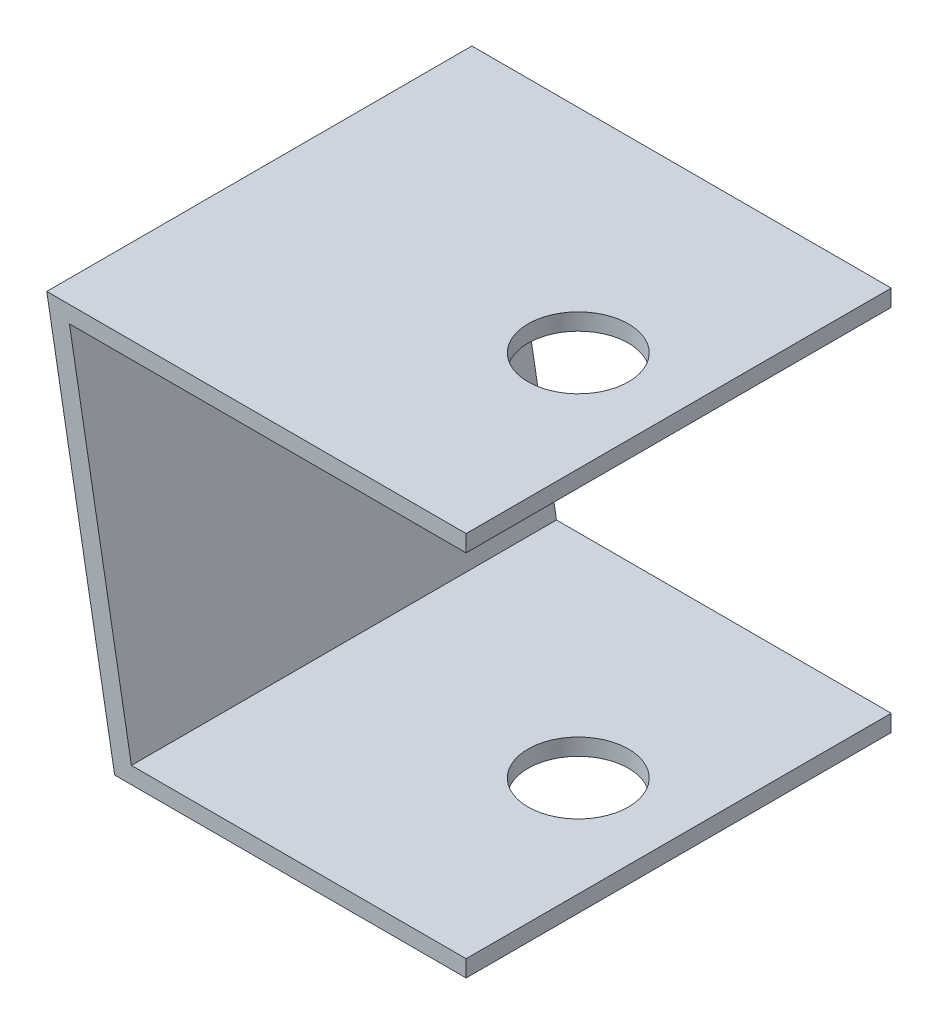
ISO-10303-21;
HEADER;
FILE_DESCRIPTION(('STEP AP214'),'2;1');
FILE_NAME('part.step','',(''),(''),'','','');
FILE_SCHEMA(('AUTOMOTIVE_DESIGN { 1 0 10303 214 1 1 1 1 }'));
ENDSEC;
DATA;
#1=APPLICATION_CONTEXT('core data for automotive mechanical design processes');
#2=APPLICATION_PROTOCOL_DEFINITION('international standard','automotive_design',2000,#1);
#3=PRODUCT_CONTEXT('',#1,'mechanical');
#4=PRODUCT('Part','Part','',(#3));
#5=PRODUCT_RELATED_PRODUCT_CATEGORY('part','',(#4));
#6=PRODUCT_DEFINITION_FORMATION('','',#4);
#7=PRODUCT_DEFINITION_CONTEXT('part definition',#1,'design');
#8=PRODUCT_DEFINITION('design','',#6,#7);
#9=PRODUCT_DEFINITION_SHAPE('','',#8);
#10=(LENGTH_UNIT() NAMED_UNIT(*) SI_UNIT(.MILLI.,.METRE.));
#11=(NAMED_UNIT(*) PLANE_ANGLE_UNIT() SI_UNIT($,.RADIAN.));
#12=(NAMED_UNIT(*) SI_UNIT($,.STERADIAN.) SOLID_ANGLE_UNIT());
#13=UNCERTAINTY_MEASURE_WITH_UNIT(LENGTH_MEASURE(1.E-05),#10,'distance_accuracy_value','');
#14=(GEOMETRIC_REPRESENTATION_CONTEXT(3) GLOBAL_UNCERTAINTY_ASSIGNED_CONTEXT((#13)) GLOBAL_UNIT_ASSIGNED_CONTEXT((#10,
#11,#12)) REPRESENTATION_CONTEXT('',''));
#15=CARTESIAN_POINT('',(0.,0.,0.));
#16=DIRECTION('',(0.,0.,1.));
#17=DIRECTION('',(1.,0.,0.));
#18=AXIS2_PLACEMENT_3D('',#15,#16,#17);
#19=CARTESIAN_POINT('',(15.,155.42638667498,31.75));
#20=DIRECTION('',(-1.,0.,0.));
#21=DIRECTION('',(0.,0.,1.));
#22=AXIS2_PLACEMENT_3D('',#19,#20,#21);
#23=PLANE('',#22);
#24=DIRECTION('',(0.,1.,0.));
#25=VECTOR('',#24,1.);
#26=CARTESIAN_POINT('',(15.,155.42638667498,-31.75));
#27=LINE('',#26,#25);
#28=CARTESIAN_POINT('',(15.,152.92638667498,-31.75));
#29=VERTEX_POINT('',#28);
#30=CARTESIAN_POINT('',(15.,155.42638667498,-31.75));
#31=VERTEX_POINT('',#30);
#32=EDGE_CURVE('E126',#29,#31,#27,.T.);
#33=ORIENTED_EDGE('',*,*,#32,.T.);
#34=DIRECTION('',(0.,0.,-1.));
#35=VECTOR('',#34,1.);
#36=CARTESIAN_POINT('',(15.,155.42638667498,31.75));
#37=LINE('',#36,#35);
#38=CARTESIAN_POINT('',(15.,155.42638667498,31.75));
#39=VERTEX_POINT('',#38);
#40=EDGE_CURVE('E11',#39,#31,#37,.T.);
#41=ORIENTED_EDGE('',*,*,#40,.F.);
#42=DIRECTION('',(0.,1.,0.));
#43=VECTOR('',#42,1.);
#44=CARTESIAN_POINT('',(15.,155.42638667498,31.75));
#45=LINE('',#44,#43);
#46=CARTESIAN_POINT('',(15.,152.92638667498,31.75));
#47=VERTEX_POINT('',#46);
#48=EDGE_CURVE('E140',#47,#39,#45,.T.);
#49=ORIENTED_EDGE('',*,*,#48,.F.);
#50=DIRECTION('',(0.,0.,-1.));
#51=VECTOR('',#50,1.);
#52=CARTESIAN_POINT('',(15.,152.92638667498,31.75));
#53=LINE('',#52,#51);
#54=EDGE_CURVE('E125',#47,#29,#53,.T.);
#55=ORIENTED_EDGE('',*,*,#54,.T.);
#56=EDGE_LOOP('',(#33,#41,#49,#55));
#57=FACE_BOUND('',#56,.T.);
#58=ADVANCED_FACE('F33',(#57),#23,.F.);
#59=CARTESIAN_POINT('',(-37.4999999999988,155.42638667498,31.75));
#60=DIRECTION('',(0.,-1.,0.));
#61=DIRECTION('',(0.,0.,-1.));
#62=AXIS2_PLACEMENT_3D('',#59,#60,#61);
#63=PLANE('',#62);
#64=CARTESIAN_POINT('',(0.,155.42638667498,0.));
#65=DIRECTION('',(0.,1.,0.));
#66=DIRECTION('',(0.,0.,1.));
#67=AXIS2_PLACEMENT_3D('',#64,#65,#66);
#68=CIRCLE('',#67,7.5);
#69=CARTESIAN_POINT('',(0.,155.42638667498,7.5));
#70=VERTEX_POINT('',#69);
#71=EDGE_CURVE('E182',#70,#70,#68,.T.);
#72=ORIENTED_EDGE('',*,*,#71,.F.);
#73=EDGE_LOOP('',(#72));
#74=FACE_BOUND('',#73,.T.);
#75=DIRECTION('',(-1.,0.,0.));
#76=VECTOR('',#75,1.);
#77=CARTESIAN_POINT('',(-37.4999999999988,155.42638667498,-31.75));
#78=LINE('',#77,#76);
#79=CARTESIAN_POINT('',(-47.6388013907359,155.42638667498,-31.75));
#80=VERTEX_POINT('',#79);
#81=EDGE_CURVE('E129',#31,#80,#78,.T.);
#82=ORIENTED_EDGE('',*,*,#81,.T.);
#83=DIRECTION('',(0.,0.,1.));
#84=VECTOR('',#83,1.);
#85=CARTESIAN_POINT('',(-47.6388013907359,155.42638667498,-31.75));
#86=LINE('',#85,#84);
#87=CARTESIAN_POINT('',(-47.6388013907359,155.42638667498,31.75));
#88=VERTEX_POINT('',#87);
#89=EDGE_CURVE('E130',#80,#88,#86,.T.);
#90=ORIENTED_EDGE('',*,*,#89,.T.);
#91=DIRECTION('',(-1.,0.,0.));
#92=VECTOR('',#91,1.);
#93=CARTESIAN_POINT('',(-37.4999999999988,155.42638667498,31.75));
#94=LINE('',#93,#92);
#95=EDGE_CURVE('E87',#39,#88,#94,.T.);
#96=ORIENTED_EDGE('',*,*,#95,.F.);
#97=ORIENTED_EDGE('',*,*,#40,.T.);
#98=EDGE_LOOP('',(#82,#90,#96,#97));
#99=FACE_BOUND('',#98,.T.);
#100=ADVANCED_FACE('F164',(#74,#99),#63,.F.);
#101=CARTESIAN_POINT('',(15.,97.9263866749797,31.75));
#102=DIRECTION('',(0.,1.,0.));
#103=DIRECTION('',(0.,0.,1.));
#104=AXIS2_PLACEMENT_3D('',#101,#102,#103);
#105=PLANE('',#104);
#106=CARTESIAN_POINT('',(0.,97.9263866749797,0.));
#107=DIRECTION('',(0.,1.,0.));
#108=DIRECTION('',(0.,0.,1.));
#109=AXIS2_PLACEMENT_3D('',#106,#107,#108);
#110=CIRCLE('',#109,7.5);
#111=CARTESIAN_POINT('',(0.,97.9263866749797,7.5));
#112=VERTEX_POINT('',#111);
#113=EDGE_CURVE('E185',#112,#112,#110,.T.);
#114=ORIENTED_EDGE('',*,*,#113,.T.);
#115=EDGE_LOOP('',(#114));
#116=FACE_BOUND('',#115,.T.);
#117=DIRECTION('',(1.,0.,0.));
#118=VECTOR('',#117,1.);
#119=CARTESIAN_POINT('',(15.,97.9263866749797,-31.75));
#120=LINE('',#119,#118);
#121=CARTESIAN_POINT('',(-37.4999999999988,97.9263866749797,-31.75));
#122=VERTEX_POINT('',#121);
#123=CARTESIAN_POINT('',(15.,97.9263866749797,-31.75));
#124=VERTEX_POINT('',#123);
#125=EDGE_CURVE('E111',#122,#124,#120,.T.);
#126=ORIENTED_EDGE('',*,*,#125,.T.);
#127=DIRECTION('',(0.,0.,-1.));
#128=VECTOR('',#127,1.);
#129=CARTESIAN_POINT('',(15.,97.9263866749797,31.75));
#130=LINE('',#129,#128);
#131=CARTESIAN_POINT('',(15.,97.9263866749797,31.75));
#132=VERTEX_POINT('',#131);
#133=EDGE_CURVE('E108',#132,#124,#130,.T.);
#134=ORIENTED_EDGE('',*,*,#133,.F.);
#135=DIRECTION('',(1.,0.,0.));
#136=VECTOR('',#135,1.);
#137=CARTESIAN_POINT('',(15.,97.9263866749797,31.75));
#138=LINE('',#137,#136);
#139=CARTESIAN_POINT('',(-37.4999999999988,97.9263866749797,31.75));
#140=VERTEX_POINT('',#139);
#141=EDGE_CURVE('E95',#140,#132,#138,.T.);
#142=ORIENTED_EDGE('',*,*,#141,.F.);
#143=DIRECTION('',(0.,0.,-1.));
#144=VECTOR('',#143,1.);
#145=CARTESIAN_POINT('',(-37.4999999999988,97.9263866749797,31.75));
#146=LINE('',#145,#144);
#147=EDGE_CURVE('E41',#140,#122,#146,.T.);
#148=ORIENTED_EDGE('',*,*,#147,.T.);
#149=EDGE_LOOP('',(#126,#134,#142,#148));
#150=FACE_BOUND('',#149,.T.);
#151=ADVANCED_FACE('F109',(#116,#150),#105,.F.);
#152=CARTESIAN_POINT('',(15.,100.42638667498,31.75));
#153=DIRECTION('',(-1.,0.,0.));
#154=DIRECTION('',(0.,0.,1.));
#155=AXIS2_PLACEMENT_3D('',#152,#153,#154);
#156=PLANE('',#155);
#157=DIRECTION('',(0.,1.,0.));
#158=VECTOR('',#157,1.);
#159=CARTESIAN_POINT('',(15.,100.42638667498,-31.75));
#160=LINE('',#159,#158);
#161=CARTESIAN_POINT('',(15.,100.42638667498,-31.75));
#162=VERTEX_POINT('',#161);
#163=EDGE_CURVE('E134',#124,#162,#160,.T.);
#164=ORIENTED_EDGE('',*,*,#163,.T.);
#165=DIRECTION('',(0.,0.,-1.));
#166=VECTOR('',#165,1.);
#167=CARTESIAN_POINT('',(15.,100.42638667498,31.75));
#168=LINE('',#167,#166);
#169=CARTESIAN_POINT('',(15.,100.42638667498,31.75));
#170=VERTEX_POINT('',#169);
#171=EDGE_CURVE('E114',#170,#162,#168,.T.);
#172=ORIENTED_EDGE('',*,*,#171,.F.);
#173=DIRECTION('',(0.,1.,0.));
#174=VECTOR('',#173,1.);
#175=CARTESIAN_POINT('',(15.,100.42638667498,31.75));
#176=LINE('',#175,#174);
#177=EDGE_CURVE('E100',#132,#170,#176,.T.);
#178=ORIENTED_EDGE('',*,*,#177,.F.);
#179=ORIENTED_EDGE('',*,*,#133,.T.);
#180=EDGE_LOOP('',(#164,#172,#178,#179));
#181=FACE_BOUND('',#180,.T.);
#182=ADVANCED_FACE('F116',(#181),#156,.F.);
#183=CARTESIAN_POINT('',(-34.9999999999988,100.42638667498,31.75));
#184=DIRECTION('',(0.,-1.,0.));
#185=DIRECTION('',(1.,0.,0.));
#186=AXIS2_PLACEMENT_3D('',#183,#184,#185);
#187=PLANE('',#186);
#188=CARTESIAN_POINT('',(0.,100.42638667498,0.));
#189=DIRECTION('',(0.,-1.,0.));
#190=DIRECTION('',(1.,0.,0.));
#191=AXIS2_PLACEMENT_3D('',#188,#189,#190);
#192=CIRCLE('',#191,7.5);
#193=CARTESIAN_POINT('',(7.5,100.42638667498,0.));
#194=VERTEX_POINT('',#193);
#195=EDGE_CURVE('E177',#194,#194,#192,.T.);
#196=ORIENTED_EDGE('',*,*,#195,.T.);
#197=EDGE_LOOP('',(#196));
#198=FACE_BOUND('',#197,.T.);
#199=DIRECTION('',(-1.,0.,0.));
#200=VECTOR('',#199,1.);
#201=CARTESIAN_POINT('',(-34.9999999999988,100.42638667498,-31.75));
#202=LINE('',#201,#200);
#203=CARTESIAN_POINT('',(-34.9999999999988,100.42638667498,-31.75));
#204=VERTEX_POINT('',#203);
#205=EDGE_CURVE('E136',#162,#204,#202,.T.);
#206=ORIENTED_EDGE('',*,*,#205,.T.);
#207=DIRECTION('',(0.,0.,-1.));
#208=VECTOR('',#207,1.);
#209=CARTESIAN_POINT('',(-34.9999999999988,100.42638667498,31.75));
#210=LINE('',#209,#208);
#211=CARTESIAN_POINT('',(-34.9999999999988,100.42638667498,31.75));
#212=VERTEX_POINT('',#211);
#213=EDGE_CURVE('E142',#212,#204,#210,.T.);
#214=ORIENTED_EDGE('',*,*,#213,.F.);
#215=DIRECTION('',(-1.,0.,0.));
#216=VECTOR('',#215,1.);
#217=CARTESIAN_POINT('',(-34.9999999999988,100.42638667498,31.75));
#218=LINE('',#217,#216);
#219=EDGE_CURVE('E119',#170,#212,#218,.T.);
#220=ORIENTED_EDGE('',*,*,#219,.F.);
#221=ORIENTED_EDGE('',*,*,#171,.T.);
#222=EDGE_LOOP('',(#206,#214,#220,#221));
#223=FACE_BOUND('',#222,.T.);
#224=ADVANCED_FACE('F218',(#198,#223),#187,.F.);
#225=CARTESIAN_POINT('',(15.,152.92638667498,31.75));
#226=DIRECTION('',(0.,1.,0.));
#227=DIRECTION('',(0.,0.,1.));
#228=AXIS2_PLACEMENT_3D('',#225,#226,#227);
#229=PLANE('',#228);
#230=CARTESIAN_POINT('',(0.,152.92638667498,0.));
#231=DIRECTION('',(0.,1.,0.));
#232=DIRECTION('',(0.,0.,1.));
#233=AXIS2_PLACEMENT_3D('',#230,#231,#232);
#234=CIRCLE('',#233,7.5);
#235=CARTESIAN_POINT('',(0.,152.92638667498,7.5));
#236=VERTEX_POINT('',#235);
#237=EDGE_CURVE('E36',#236,#236,#234,.T.);
#238=ORIENTED_EDGE('',*,*,#237,.T.);
#239=EDGE_LOOP('',(#238));
#240=FACE_BOUND('',#239,.T.);
#241=DIRECTION('',(1.,0.,0.));
#242=VECTOR('',#241,1.);
#243=CARTESIAN_POINT('',(15.,152.92638667498,-31.75));
#244=LINE('',#243,#242);
#245=CARTESIAN_POINT('',(-44.2571664871935,152.92638667498,-31.75));
#246=VERTEX_POINT('',#245);
#247=EDGE_CURVE('E48',#246,#29,#244,.T.);
#248=ORIENTED_EDGE('',*,*,#247,.T.);
#249=ORIENTED_EDGE('',*,*,#54,.F.);
#250=DIRECTION('',(1.,0.,0.));
#251=VECTOR('',#250,1.);
#252=CARTESIAN_POINT('',(15.,152.92638667498,31.75));
#253=LINE('',#252,#251);
#254=CARTESIAN_POINT('',(-44.2571664871935,152.92638667498,31.75));
#255=VERTEX_POINT('',#254);
#256=EDGE_CURVE('E57',#255,#47,#253,.T.);
#257=ORIENTED_EDGE('',*,*,#256,.F.);
#258=DIRECTION('',(0.,0.,1.));
#259=VECTOR('',#258,1.);
#260=CARTESIAN_POINT('',(-44.2571664871935,152.92638667498,-31.75));
#261=LINE('',#260,#259);
#262=EDGE_CURVE('E156',#246,#255,#261,.T.);
#263=ORIENTED_EDGE('',*,*,#262,.F.);
#264=EDGE_LOOP('',(#248,#249,#257,#263));
#265=FACE_BOUND('',#264,.T.);
#266=ADVANCED_FACE('F166',(#240,#265),#229,.F.);
#267=CARTESIAN_POINT('',(0.,0.,31.75));
#268=DIRECTION('',(0.,0.,-1.));
#269=DIRECTION('',(-1.,0.,0.));
#270=AXIS2_PLACEMENT_3D('',#267,#268,#269);
#271=PLANE('',#270);
#272=ORIENTED_EDGE('',*,*,#219,.T.);
#273=DIRECTION('',(0.173648177666935,-0.984807753012207,0.));
#274=VECTOR('',#273,1.);
#275=CARTESIAN_POINT('',(-44.2571664871935,152.92638667498,31.75));
#276=LINE('',#275,#274);
#277=EDGE_CURVE('E174',#255,#212,#276,.T.);
#278=ORIENTED_EDGE('',*,*,#277,.F.);
#279=ORIENTED_EDGE('',*,*,#256,.T.);
#280=ORIENTED_EDGE('',*,*,#48,.T.);
#281=ORIENTED_EDGE('',*,*,#95,.T.);
#282=DIRECTION('',(0.173648177666935,-0.984807753012207,0.));
#283=VECTOR('',#282,1.);
#284=CARTESIAN_POINT('',(-37.4999999999988,97.9263866749797,31.75));
#285=LINE('',#284,#283);
#286=EDGE_CURVE('E103',#88,#140,#285,.T.);
#287=ORIENTED_EDGE('',*,*,#286,.T.);
#288=ORIENTED_EDGE('',*,*,#141,.T.);
#289=ORIENTED_EDGE('',*,*,#177,.T.);
#290=EDGE_LOOP('',(#272,#278,#279,#280,#281,#287,#288,#289));
#291=FACE_BOUND('',#290,.T.);
#292=ADVANCED_FACE('F98',(#291),#271,.F.);
#293=CARTESIAN_POINT('',(0.,0.,-31.75));
#294=DIRECTION('',(0.,0.,-1.));
#295=DIRECTION('',(-1.,0.,0.));
#296=AXIS2_PLACEMENT_3D('',#293,#294,#295);
#297=PLANE('',#296);
#298=DIRECTION('',(0.173648177666935,-0.984807753012207,0.));
#299=VECTOR('',#298,1.);
#300=CARTESIAN_POINT('',(-44.2571664871935,152.92638667498,-31.75));
#301=LINE('',#300,#299);
#302=EDGE_CURVE('E175',#246,#204,#301,.T.);
#303=ORIENTED_EDGE('',*,*,#302,.T.);
#304=ORIENTED_EDGE('',*,*,#205,.F.);
#305=ORIENTED_EDGE('',*,*,#163,.F.);
#306=ORIENTED_EDGE('',*,*,#125,.F.);
#307=DIRECTION('',(0.173648177666935,-0.984807753012207,0.));
#308=VECTOR('',#307,1.);
#309=CARTESIAN_POINT('',(-37.4999999999988,97.9263866749797,-31.75));
#310=LINE('',#309,#308);
#311=EDGE_CURVE('E150',#80,#122,#310,.T.);
#312=ORIENTED_EDGE('',*,*,#311,.F.);
#313=ORIENTED_EDGE('',*,*,#81,.F.);
#314=ORIENTED_EDGE('',*,*,#32,.F.);
#315=ORIENTED_EDGE('',*,*,#247,.F.);
#316=EDGE_LOOP('',(#303,#304,#305,#306,#312,#313,#314,#315));
#317=FACE_BOUND('',#316,.T.);
#318=ADVANCED_FACE('F149',(#317),#297,.T.);
#319=CARTESIAN_POINT('',(-37.4999999999988,97.9263866749797,-31.75));
#320=DIRECTION('',(-0.984807753012207,-0.173648177666935,0.));
#321=DIRECTION('',(0.173648177666935,-0.984807753012207,0.));
#322=AXIS2_PLACEMENT_3D('',#319,#320,#321);
#323=PLANE('',#322);
#324=ORIENTED_EDGE('',*,*,#286,.F.);
#325=ORIENTED_EDGE('',*,*,#89,.F.);
#326=ORIENTED_EDGE('',*,*,#311,.T.);
#327=ORIENTED_EDGE('',*,*,#147,.F.);
#328=EDGE_LOOP('',(#324,#325,#326,#327));
#329=FACE_BOUND('',#328,.T.);
#330=ADVANCED_FACE('F153',(#329),#323,.T.);
#331=CARTESIAN_POINT('',(-44.2571664871935,152.92638667498,-31.75));
#332=DIRECTION('',(-0.984807753012207,-0.173648177666935,0.));
#333=DIRECTION('',(0.173648177666935,-0.984807753012207,0.));
#334=AXIS2_PLACEMENT_3D('',#331,#332,#333);
#335=PLANE('',#334);
#336=ORIENTED_EDGE('',*,*,#277,.T.);
#337=ORIENTED_EDGE('',*,*,#213,.T.);
#338=ORIENTED_EDGE('',*,*,#302,.F.);
#339=ORIENTED_EDGE('',*,*,#262,.T.);
#340=EDGE_LOOP('',(#336,#337,#338,#339));
#341=FACE_BOUND('',#340,.T.);
#342=ADVANCED_FACE('F173',(#341),#335,.F.);
#343=CARTESIAN_POINT('',(0.,97.9263866749797,0.));
#344=DIRECTION('',(0.,1.,0.));
#345=DIRECTION('',(0.,0.,1.));
#346=AXIS2_PLACEMENT_3D('',#343,#344,#345);
#347=CYLINDRICAL_SURFACE('',#346,7.5);
#348=ORIENTED_EDGE('',*,*,#71,.T.);
#349=EDGE_LOOP('',(#348));
#350=FACE_BOUND('',#349,.T.);
#351=ORIENTED_EDGE('',*,*,#237,.F.);
#352=EDGE_LOOP('',(#351));
#353=FACE_BOUND('',#352,.T.);
#354=ADVANCED_FACE('F193',(#350,#353),#347,.F.);
#355=ORIENTED_EDGE('',*,*,#113,.F.);
#356=EDGE_LOOP('',(#355));
#357=FACE_BOUND('',#356,.T.);
#358=ORIENTED_EDGE('',*,*,#195,.F.);
#359=EDGE_LOOP('',(#358));
#360=FACE_BOUND('',#359,.T.);
#361=ADVANCED_FACE('F195',(#357,#360),#347,.F.);
#362=CLOSED_SHELL('',(#58,#100,#151,#182,#224,#266,#292,#318,#330,#342,#354,#361));
#363=MANIFOLD_SOLID_BREP('B2',#362);
#364=ADVANCED_BREP_SHAPE_REPRESENTATION('',(#18,#363),#14);
#365=SHAPE_DEFINITION_REPRESENTATION(#9,#364);
ENDSEC;
END-ISO-10303-21;
